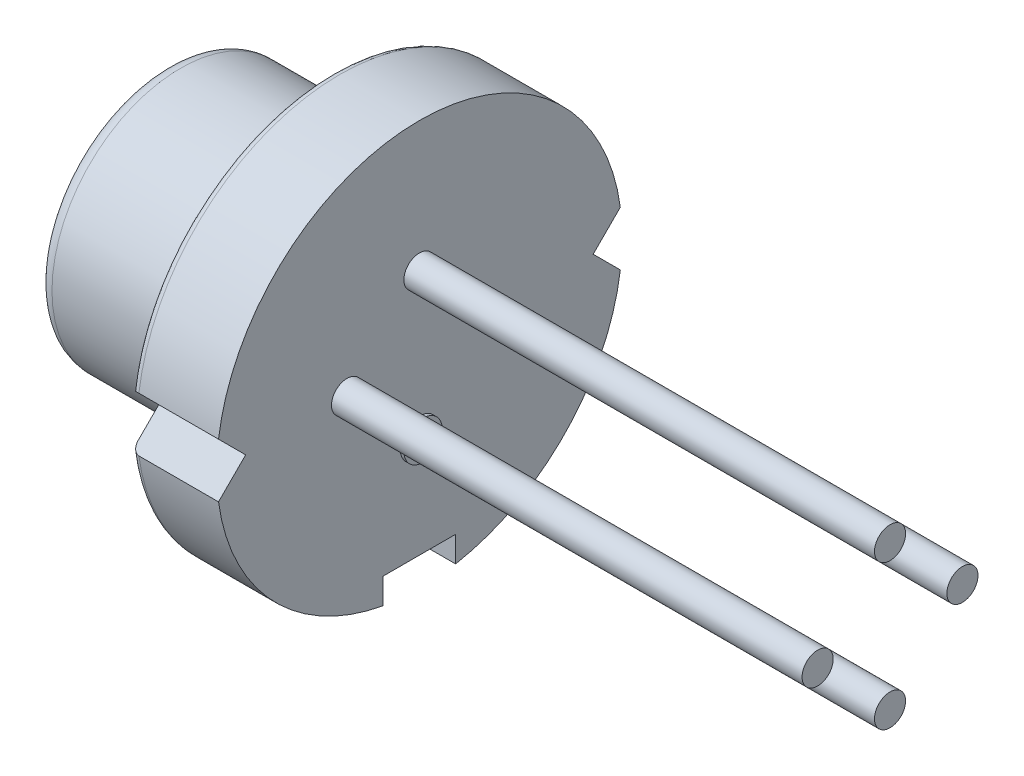
ISO-10303-21;
HEADER;
FILE_DESCRIPTION(('STEP AP214'),'2;1');
FILE_NAME('part.step','',(''),(''),'','','');
FILE_SCHEMA(('AUTOMOTIVE_DESIGN { 1 0 10303 214 1 1 1 1 }'));
ENDSEC;
DATA;
#1=APPLICATION_CONTEXT('core data for automotive mechanical design processes');
#2=APPLICATION_PROTOCOL_DEFINITION('international standard','automotive_design',2000,#1);
#3=PRODUCT_CONTEXT('',#1,'mechanical');
#4=PRODUCT('Part','Part','',(#3));
#5=PRODUCT_RELATED_PRODUCT_CATEGORY('part','',(#4));
#6=PRODUCT_DEFINITION_FORMATION('','',#4);
#7=PRODUCT_DEFINITION_CONTEXT('part definition',#1,'design');
#8=PRODUCT_DEFINITION('design','',#6,#7);
#9=PRODUCT_DEFINITION_SHAPE('','',#8);
#10=(LENGTH_UNIT() NAMED_UNIT(*) SI_UNIT(.MILLI.,.METRE.));
#11=(NAMED_UNIT(*) PLANE_ANGLE_UNIT() SI_UNIT($,.RADIAN.));
#12=(NAMED_UNIT(*) SI_UNIT($,.STERADIAN.) SOLID_ANGLE_UNIT());
#13=UNCERTAINTY_MEASURE_WITH_UNIT(LENGTH_MEASURE(1.E-05),#10,'distance_accuracy_value','');
#14=(GEOMETRIC_REPRESENTATION_CONTEXT(3) GLOBAL_UNCERTAINTY_ASSIGNED_CONTEXT((#13)) GLOBAL_UNIT_ASSIGNED_CONTEXT((#10,
#11,#12)) REPRESENTATION_CONTEXT('',''));
#15=CARTESIAN_POINT('',(0.,0.,0.));
#16=DIRECTION('',(0.,0.,1.));
#17=DIRECTION('',(1.,0.,0.));
#18=AXIS2_PLACEMENT_3D('',#15,#16,#17);
#19=CARTESIAN_POINT('',(2.5,0.,0.));
#20=DIRECTION('',(-1.,0.,0.));
#21=DIRECTION('',(0.,0.,1.));
#22=AXIS2_PLACEMENT_3D('',#19,#20,#21);
#23=PLANE('',#22);
#24=DIRECTION('',(0.,1.,0.));
#25=VECTOR('',#24,1.);
#26=CARTESIAN_POINT('',(2.5,0.,0.5));
#27=LINE('',#26,#25);
#28=CARTESIAN_POINT('',(2.5,-2.75499546279118,0.5));
#29=VERTEX_POINT('',#28);
#30=CARTESIAN_POINT('',(2.5,-2.4,0.5));
#31=VERTEX_POINT('',#30);
#32=EDGE_CURVE('E133',#29,#31,#27,.T.);
#33=ORIENTED_EDGE('',*,*,#32,.T.);
#34=DIRECTION('',(0.,0.,1.));
#35=VECTOR('',#34,1.);
#36=CARTESIAN_POINT('',(2.5,-2.4,0.));
#37=LINE('',#36,#35);
#38=CARTESIAN_POINT('',(2.5,-2.4,-0.5));
#39=VERTEX_POINT('',#38);
#40=EDGE_CURVE('E431',#39,#31,#37,.T.);
#41=ORIENTED_EDGE('',*,*,#40,.F.);
#42=DIRECTION('',(0.,1.,0.));
#43=VECTOR('',#42,1.);
#44=CARTESIAN_POINT('',(2.5,0.,-0.5));
#45=LINE('',#44,#43);
#46=CARTESIAN_POINT('',(2.5,-2.75499546279118,-0.5));
#47=VERTEX_POINT('',#46);
#48=EDGE_CURVE('E144',#47,#39,#45,.T.);
#49=ORIENTED_EDGE('',*,*,#48,.F.);
#50=CARTESIAN_POINT('',(2.5,0.,0.));
#51=DIRECTION('',(-1.,0.,0.));
#52=DIRECTION('',(0.,0.,1.));
#53=AXIS2_PLACEMENT_3D('',#50,#51,#52);
#54=CIRCLE('',#53,2.8);
#55=CARTESIAN_POINT('',(2.5,-0.374801574802347,-2.77480157480236));
#56=VERTEX_POINT('',#55);
#57=EDGE_CURVE('E162',#56,#47,#54,.T.);
#58=ORIENTED_EDGE('',*,*,#57,.F.);
#59=DIRECTION('',(0.,-0.707106781186532,-0.707106781186563));
#60=VECTOR('',#59,1.);
#61=CARTESIAN_POINT('',(2.5,1.2,-1.19999999999995));
#62=LINE('',#61,#60);
#63=CARTESIAN_POINT('',(2.5,0.,-2.4));
#64=VERTEX_POINT('',#63);
#65=EDGE_CURVE('E419',#64,#56,#62,.T.);
#66=ORIENTED_EDGE('',*,*,#65,.F.);
#67=DIRECTION('',(0.,0.707106781186531,-0.707106781186564));
#68=VECTOR('',#67,1.);
#69=CARTESIAN_POINT('',(2.5,-1.2,-1.19999999999994));
#70=LINE('',#69,#68);
#71=CARTESIAN_POINT('',(2.5,0.374801574802347,-2.77480157480236));
#72=VERTEX_POINT('',#71);
#73=EDGE_CURVE('E422',#64,#72,#70,.T.);
#74=ORIENTED_EDGE('',*,*,#73,.T.);
#75=CARTESIAN_POINT('',(2.5,0.374801574802348,2.77480157480236));
#76=VERTEX_POINT('',#75);
#77=EDGE_CURVE('E165',#76,#72,#54,.T.);
#78=ORIENTED_EDGE('',*,*,#77,.F.);
#79=DIRECTION('',(0.,0.707106781186532,0.707106781186563));
#80=VECTOR('',#79,1.);
#81=CARTESIAN_POINT('',(2.5,-1.2,1.19999999999995));
#82=LINE('',#81,#80);
#83=CARTESIAN_POINT('',(2.5,0.,2.4));
#84=VERTEX_POINT('',#83);
#85=EDGE_CURVE('E408',#84,#76,#82,.T.);
#86=ORIENTED_EDGE('',*,*,#85,.F.);
#87=DIRECTION('',(0.,-0.707106781186532,0.707106781186563));
#88=VECTOR('',#87,1.);
#89=CARTESIAN_POINT('',(2.5,1.2,1.19999999999995));
#90=LINE('',#89,#88);
#91=CARTESIAN_POINT('',(2.5,-0.374801574802348,2.77480157480236));
#92=VERTEX_POINT('',#91);
#93=EDGE_CURVE('E161',#84,#92,#90,.T.);
#94=ORIENTED_EDGE('',*,*,#93,.T.);
#95=EDGE_CURVE('E151',#29,#92,#54,.T.);
#96=ORIENTED_EDGE('',*,*,#95,.F.);
#97=EDGE_LOOP('',(#33,#41,#49,#58,#66,#74,#78,#86,#94,#96));
#98=FACE_BOUND('',#97,.T.);
#99=CARTESIAN_POINT('',(2.5,0.,-1.));
#100=DIRECTION('',(-1.,0.,0.));
#101=DIRECTION('',(0.,0.,1.));
#102=AXIS2_PLACEMENT_3D('',#99,#100,#101);
#103=CIRCLE('',#102,0.215);
#104=CARTESIAN_POINT('',(2.5,0.,-0.785));
#105=VERTEX_POINT('',#104);
#106=EDGE_CURVE('E190',#105,#105,#103,.F.);
#107=ORIENTED_EDGE('',*,*,#106,.F.);
#108=EDGE_LOOP('',(#107));
#109=FACE_BOUND('',#108,.T.);
#110=CARTESIAN_POINT('',(2.5,0.,1.));
#111=DIRECTION('',(-1.,0.,0.));
#112=DIRECTION('',(0.,0.,1.));
#113=AXIS2_PLACEMENT_3D('',#110,#111,#112);
#114=CIRCLE('',#113,0.215);
#115=CARTESIAN_POINT('',(2.5,0.,1.215));
#116=VERTEX_POINT('',#115);
#117=EDGE_CURVE('E187',#116,#116,#114,.F.);
#118=ORIENTED_EDGE('',*,*,#117,.F.);
#119=EDGE_LOOP('',(#118));
#120=FACE_BOUND('',#119,.T.);
#121=CARTESIAN_POINT('',(2.5,1.,0.));
#122=DIRECTION('',(-1.,0.,0.));
#123=DIRECTION('',(0.,0.,1.));
#124=AXIS2_PLACEMENT_3D('',#121,#122,#123);
#125=CIRCLE('',#124,0.215);
#126=CARTESIAN_POINT('',(2.5,1.,0.215));
#127=VERTEX_POINT('',#126);
#128=EDGE_CURVE('E193',#127,#127,#125,.F.);
#129=ORIENTED_EDGE('',*,*,#128,.F.);
#130=EDGE_LOOP('',(#129));
#131=FACE_BOUND('',#130,.T.);
#132=CARTESIAN_POINT('',(2.5,-1.,0.));
#133=DIRECTION('',(-1.,0.,0.));
#134=DIRECTION('',(0.,0.,1.));
#135=AXIS2_PLACEMENT_3D('',#132,#133,#134);
#136=CIRCLE('',#135,0.265);
#137=CARTESIAN_POINT('',(2.5,-1.,0.265));
#138=VERTEX_POINT('',#137);
#139=EDGE_CURVE('E11',#138,#138,#136,.F.);
#140=ORIENTED_EDGE('',*,*,#139,.F.);
#141=EDGE_LOOP('',(#140));
#142=FACE_BOUND('',#141,.T.);
#143=ADVANCED_FACE('F37',(#98,#109,#120,#131,#142),#23,.F.);
#144=CARTESIAN_POINT('',(1.3,2.8,0.));
#145=DIRECTION('',(1.,0.,0.));
#146=DIRECTION('',(0.,0.,-1.));
#147=AXIS2_PLACEMENT_3D('',#144,#145,#146);
#148=PLANE('',#147);
#149=CARTESIAN_POINT('',(1.3,0.,0.));
#150=DIRECTION('',(-1.,0.,0.));
#151=DIRECTION('',(0.,0.,1.));
#152=AXIS2_PLACEMENT_3D('',#149,#150,#151);
#153=CIRCLE('',#152,2.1);
#154=CARTESIAN_POINT('',(1.3,0.,2.1));
#155=VERTEX_POINT('',#154);
#156=EDGE_CURVE('E172',#155,#155,#153,.T.);
#157=ORIENTED_EDGE('',*,*,#156,.F.);
#158=EDGE_LOOP('',(#157));
#159=FACE_BOUND('',#158,.T.);
#160=DIRECTION('',(0.,-0.707106781186532,-0.707106781186563));
#161=VECTOR('',#160,1.);
#162=CARTESIAN_POINT('',(1.3,2.59999999999994,0.200000000000053));
#163=LINE('',#162,#161);
#164=CARTESIAN_POINT('',(1.3,0.,-2.4));
#165=VERTEX_POINT('',#164);
#166=CARTESIAN_POINT('',(1.3,-0.28492424049174,-2.68492424049175));
#167=VERTEX_POINT('',#166);
#168=EDGE_CURVE('E414',#165,#167,#163,.T.);
#169=ORIENTED_EDGE('',*,*,#168,.T.);
#170=CARTESIAN_POINT('',(1.3,0.,0.));
#171=DIRECTION('',(1.,0.,0.));
#172=DIRECTION('',(0.,0.,-1.));
#173=AXIS2_PLACEMENT_3D('',#170,#171,#172);
#174=CIRCLE('',#173,2.7);
#175=CARTESIAN_POINT('',(1.3,-2.65329983228432,-0.5));
#176=VERTEX_POINT('',#175);
#177=EDGE_CURVE('E220',#167,#176,#174,.F.);
#178=ORIENTED_EDGE('',*,*,#177,.T.);
#179=DIRECTION('',(0.,1.,0.));
#180=VECTOR('',#179,1.);
#181=CARTESIAN_POINT('',(1.3,2.8,-0.5));
#182=LINE('',#181,#180);
#183=CARTESIAN_POINT('',(1.3,-2.4,-0.5));
#184=VERTEX_POINT('',#183);
#185=EDGE_CURVE('E427',#176,#184,#182,.T.);
#186=ORIENTED_EDGE('',*,*,#185,.T.);
#187=DIRECTION('',(0.,0.,1.));
#188=VECTOR('',#187,1.);
#189=CARTESIAN_POINT('',(1.3,-2.4,0.));
#190=LINE('',#189,#188);
#191=CARTESIAN_POINT('',(1.3,-2.4,0.5));
#192=VERTEX_POINT('',#191);
#193=EDGE_CURVE('E155',#184,#192,#190,.T.);
#194=ORIENTED_EDGE('',*,*,#193,.T.);
#195=DIRECTION('',(0.,1.,0.));
#196=VECTOR('',#195,1.);
#197=CARTESIAN_POINT('',(1.3,2.8,0.5));
#198=LINE('',#197,#196);
#199=CARTESIAN_POINT('',(1.3,-2.65329983228432,0.5));
#200=VERTEX_POINT('',#199);
#201=EDGE_CURVE('E425',#200,#192,#198,.T.);
#202=ORIENTED_EDGE('',*,*,#201,.F.);
#203=CARTESIAN_POINT('',(1.3,0.,0.));
#204=DIRECTION('',(1.,0.,0.));
#205=DIRECTION('',(0.,0.,-1.));
#206=AXIS2_PLACEMENT_3D('',#203,#204,#205);
#207=CIRCLE('',#206,2.7);
#208=CARTESIAN_POINT('',(1.3,-0.284924240491739,2.68492424049175));
#209=VERTEX_POINT('',#208);
#210=EDGE_CURVE('E217',#200,#209,#207,.F.);
#211=ORIENTED_EDGE('',*,*,#210,.T.);
#212=DIRECTION('',(0.,-0.707106781186532,0.707106781186563));
#213=VECTOR('',#212,1.);
#214=CARTESIAN_POINT('',(1.3,2.59999999999994,-0.200000000000053));
#215=LINE('',#214,#213);
#216=CARTESIAN_POINT('',(1.3,0.,2.4));
#217=VERTEX_POINT('',#216);
#218=EDGE_CURVE('E400',#217,#209,#215,.T.);
#219=ORIENTED_EDGE('',*,*,#218,.F.);
#220=DIRECTION('',(0.,0.707106781186532,0.707106781186563));
#221=VECTOR('',#220,1.);
#222=CARTESIAN_POINT('',(1.3,0.199999999999939,2.59999999999995));
#223=LINE('',#222,#221);
#224=CARTESIAN_POINT('',(1.3,0.284924240491739,2.68492424049175));
#225=VERTEX_POINT('',#224);
#226=EDGE_CURVE('E403',#217,#225,#223,.T.);
#227=ORIENTED_EDGE('',*,*,#226,.T.);
#228=CARTESIAN_POINT('',(1.3,0.,0.));
#229=DIRECTION('',(1.,0.,0.));
#230=DIRECTION('',(0.,0.,-1.));
#231=AXIS2_PLACEMENT_3D('',#228,#229,#230);
#232=CIRCLE('',#231,2.7);
#233=CARTESIAN_POINT('',(1.3,0.284924240491738,-2.68492424049175));
#234=VERTEX_POINT('',#233);
#235=EDGE_CURVE('E214',#225,#234,#232,.F.);
#236=ORIENTED_EDGE('',*,*,#235,.T.);
#237=DIRECTION('',(0.,0.707106781186531,-0.707106781186564));
#238=VECTOR('',#237,1.);
#239=CARTESIAN_POINT('',(1.3,0.199999999999934,-2.59999999999994));
#240=LINE('',#239,#238);
#241=EDGE_CURVE('E412',#165,#234,#240,.T.);
#242=ORIENTED_EDGE('',*,*,#241,.F.);
#243=EDGE_LOOP('',(#169,#178,#186,#194,#202,#211,#219,#227,#236,#242));
#244=FACE_BOUND('',#243,.T.);
#245=ADVANCED_FACE('F336',(#159,#244),#148,.F.);
#246=CARTESIAN_POINT('',(-2.49171245983604,0.,0.));
#247=DIRECTION('',(-1.,0.,0.));
#248=DIRECTION('',(0.,0.,1.));
#249=AXIS2_PLACEMENT_3D('',#246,#247,#248);
#250=CYLINDRICAL_SURFACE('',#249,2.8);
#251=DIRECTION('',(-1.,0.,0.));
#252=VECTOR('',#251,1.);
#253=CARTESIAN_POINT('',(-2.49171245983604,-0.374801574802348,2.77480157480236));
#254=LINE('',#253,#252);
#255=CARTESIAN_POINT('',(1.4,-0.374801574802348,2.77480157480236));
#256=VERTEX_POINT('',#255);
#257=EDGE_CURVE('E198',#256,#92,#254,.F.);
#258=ORIENTED_EDGE('',*,*,#257,.F.);
#259=CARTESIAN_POINT('',(1.4,0.,0.));
#260=DIRECTION('',(1.,0.,0.));
#261=DIRECTION('',(0.,0.,-1.));
#262=AXIS2_PLACEMENT_3D('',#259,#260,#261);
#263=CIRCLE('',#262,2.8);
#264=CARTESIAN_POINT('',(1.4,-2.75499546279118,0.5));
#265=VERTEX_POINT('',#264);
#266=EDGE_CURVE('E154',#256,#265,#263,.T.);
#267=ORIENTED_EDGE('',*,*,#266,.T.);
#268=DIRECTION('',(-1.,0.,0.));
#269=VECTOR('',#268,1.);
#270=CARTESIAN_POINT('',(-2.49171245983604,-2.75499546279118,0.5));
#271=LINE('',#270,#269);
#272=EDGE_CURVE('E136',#29,#265,#271,.T.);
#273=ORIENTED_EDGE('',*,*,#272,.F.);
#274=ORIENTED_EDGE('',*,*,#95,.T.);
#275=EDGE_LOOP('',(#258,#267,#273,#274));
#276=FACE_BOUND('',#275,.T.);
#277=ADVANCED_FACE('F150',(#276),#250,.T.);
#278=DIRECTION('',(-1.,0.,0.));
#279=VECTOR('',#278,1.);
#280=CARTESIAN_POINT('',(-2.49171245983604,0.374801574802347,-2.77480157480236));
#281=LINE('',#280,#279);
#282=CARTESIAN_POINT('',(1.4,0.374801574802347,-2.77480157480236));
#283=VERTEX_POINT('',#282);
#284=EDGE_CURVE('E202',#283,#72,#281,.F.);
#285=ORIENTED_EDGE('',*,*,#284,.F.);
#286=CARTESIAN_POINT('',(1.4,0.,0.));
#287=DIRECTION('',(1.,0.,0.));
#288=DIRECTION('',(0.,0.,-1.));
#289=AXIS2_PLACEMENT_3D('',#286,#287,#288);
#290=CIRCLE('',#289,2.8);
#291=CARTESIAN_POINT('',(1.4,0.374801574802348,2.77480157480236));
#292=VERTEX_POINT('',#291);
#293=EDGE_CURVE('E53',#283,#292,#290,.T.);
#294=ORIENTED_EDGE('',*,*,#293,.T.);
#295=DIRECTION('',(-1.,0.,0.));
#296=VECTOR('',#295,1.);
#297=CARTESIAN_POINT('',(-2.49171245983604,0.374801574802348,2.77480157480236));
#298=LINE('',#297,#296);
#299=EDGE_CURVE('E196',#292,#76,#298,.F.);
#300=ORIENTED_EDGE('',*,*,#299,.T.);
#301=ORIENTED_EDGE('',*,*,#77,.T.);
#302=EDGE_LOOP('',(#285,#294,#300,#301));
#303=FACE_BOUND('',#302,.T.);
#304=ADVANCED_FACE('F341',(#303),#250,.T.);
#305=DIRECTION('',(-1.,0.,0.));
#306=VECTOR('',#305,1.);
#307=CARTESIAN_POINT('',(-2.49171245983604,-2.75499546279118,-0.5));
#308=LINE('',#307,#306);
#309=CARTESIAN_POINT('',(1.4,-2.75499546279118,-0.5));
#310=VERTEX_POINT('',#309);
#311=EDGE_CURVE('E156',#47,#310,#308,.T.);
#312=ORIENTED_EDGE('',*,*,#311,.T.);
#313=CARTESIAN_POINT('',(1.4,0.,0.));
#314=DIRECTION('',(1.,0.,0.));
#315=DIRECTION('',(0.,0.,-1.));
#316=AXIS2_PLACEMENT_3D('',#313,#314,#315);
#317=CIRCLE('',#316,2.8);
#318=CARTESIAN_POINT('',(1.4,-0.374801574802348,-2.77480157480236));
#319=VERTEX_POINT('',#318);
#320=EDGE_CURVE('E230',#310,#319,#317,.T.);
#321=ORIENTED_EDGE('',*,*,#320,.T.);
#322=DIRECTION('',(-1.,0.,0.));
#323=VECTOR('',#322,1.);
#324=CARTESIAN_POINT('',(-2.49171245983604,-0.374801574802348,-2.77480157480236));
#325=LINE('',#324,#323);
#326=EDGE_CURVE('E200',#319,#56,#325,.F.);
#327=ORIENTED_EDGE('',*,*,#326,.T.);
#328=ORIENTED_EDGE('',*,*,#57,.T.);
#329=EDGE_LOOP('',(#312,#321,#327,#328));
#330=FACE_BOUND('',#329,.T.);
#331=ADVANCED_FACE('F337',(#330),#250,.T.);
#332=CARTESIAN_POINT('',(-1.,0.8,0.));
#333=DIRECTION('',(1.,0.,0.));
#334=DIRECTION('',(0.,0.,-1.));
#335=AXIS2_PLACEMENT_3D('',#332,#333,#334);
#336=PLANE('',#335);
#337=CARTESIAN_POINT('',(-1.,0.,0.));
#338=DIRECTION('',(1.,0.,0.));
#339=DIRECTION('',(0.,0.,-1.));
#340=AXIS2_PLACEMENT_3D('',#337,#338,#339);
#341=CIRCLE('',#340,1.575);
#342=CARTESIAN_POINT('',(-1.,0.,-1.575));
#343=VERTEX_POINT('',#342);
#344=EDGE_CURVE('E208',#343,#343,#341,.F.);
#345=ORIENTED_EDGE('',*,*,#344,.T.);
#346=EDGE_LOOP('',(#345));
#347=FACE_BOUND('',#346,.T.);
#348=CARTESIAN_POINT('',(-1.,0.,0.));
#349=DIRECTION('',(-1.,0.,0.));
#350=DIRECTION('',(0.,0.,1.));
#351=AXIS2_PLACEMENT_3D('',#348,#349,#350);
#352=CIRCLE('',#351,0.8);
#353=CARTESIAN_POINT('',(-1.,0.,0.8));
#354=VERTEX_POINT('',#353);
#355=EDGE_CURVE('E375',#354,#354,#352,.T.);
#356=ORIENTED_EDGE('',*,*,#355,.F.);
#357=EDGE_LOOP('',(#356));
#358=FACE_BOUND('',#357,.T.);
#359=ADVANCED_FACE('F340',(#347,#358),#336,.F.);
#360=CARTESIAN_POINT('',(-2.49171245983604,0.,0.));
#361=DIRECTION('',(-1.,0.,0.));
#362=DIRECTION('',(0.,0.,1.));
#363=AXIS2_PLACEMENT_3D('',#360,#361,#362);
#364=CYLINDRICAL_SURFACE('',#363,1.775);
#365=CARTESIAN_POINT('',(-0.8,0.,0.));
#366=DIRECTION('',(1.,0.,0.));
#367=DIRECTION('',(0.,0.,-1.));
#368=AXIS2_PLACEMENT_3D('',#365,#366,#367);
#369=CIRCLE('',#368,1.775);
#370=CARTESIAN_POINT('',(-0.8,0.,-1.775));
#371=VERTEX_POINT('',#370);
#372=EDGE_CURVE('E211',#371,#371,#369,.T.);
#373=ORIENTED_EDGE('',*,*,#372,.T.);
#374=EDGE_LOOP('',(#373));
#375=FACE_BOUND('',#374,.T.);
#376=CARTESIAN_POINT('',(0.75,0.,0.));
#377=DIRECTION('',(-1.,0.,0.));
#378=DIRECTION('',(0.,0.,1.));
#379=AXIS2_PLACEMENT_3D('',#376,#377,#378);
#380=CIRCLE('',#379,1.775);
#381=CARTESIAN_POINT('',(0.75,0.,1.775));
#382=VERTEX_POINT('',#381);
#383=EDGE_CURVE('E184',#382,#382,#380,.T.);
#384=ORIENTED_EDGE('',*,*,#383,.T.);
#385=EDGE_LOOP('',(#384));
#386=FACE_BOUND('',#385,.T.);
#387=ADVANCED_FACE('F356',(#375,#386),#364,.T.);
#388=CARTESIAN_POINT('',(0.75,0.,0.));
#389=DIRECTION('',(-1.,0.,0.));
#390=DIRECTION('',(0.,0.,1.));
#391=AXIS2_PLACEMENT_3D('',#388,#389,#390);
#392=TOROIDAL_SURFACE('',#391,2.025,0.25);
#393=ORIENTED_EDGE('',*,*,#383,.F.);
#394=EDGE_LOOP('',(#393));
#395=FACE_BOUND('',#394,.T.);
#396=CARTESIAN_POINT('',(1.,0.,0.));
#397=DIRECTION('',(-1.,0.,0.));
#398=DIRECTION('',(0.,0.,1.));
#399=AXIS2_PLACEMENT_3D('',#396,#397,#398);
#400=CIRCLE('',#399,2.025);
#401=CARTESIAN_POINT('',(1.,0.,2.025));
#402=VERTEX_POINT('',#401);
#403=EDGE_CURVE('E179',#402,#402,#400,.T.);
#404=ORIENTED_EDGE('',*,*,#403,.T.);
#405=EDGE_LOOP('',(#404));
#406=FACE_BOUND('',#405,.T.);
#407=ADVANCED_FACE('F352',(#395,#406),#392,.F.);
#408=CARTESIAN_POINT('',(1.,2.1,0.));
#409=DIRECTION('',(1.,0.,0.));
#410=DIRECTION('',(0.,0.,-1.));
#411=AXIS2_PLACEMENT_3D('',#408,#409,#410);
#412=PLANE('',#411);
#413=ORIENTED_EDGE('',*,*,#403,.F.);
#414=EDGE_LOOP('',(#413));
#415=FACE_BOUND('',#414,.T.);
#416=CARTESIAN_POINT('',(0.999999999999999,0.,0.));
#417=DIRECTION('',(-1.,0.,0.));
#418=DIRECTION('',(0.,0.,1.));
#419=AXIS2_PLACEMENT_3D('',#416,#417,#418);
#420=CIRCLE('',#419,2.1);
#421=CARTESIAN_POINT('',(0.999999999999999,0.,2.1));
#422=VERTEX_POINT('',#421);
#423=EDGE_CURVE('E175',#422,#422,#420,.T.);
#424=ORIENTED_EDGE('',*,*,#423,.T.);
#425=EDGE_LOOP('',(#424));
#426=FACE_BOUND('',#425,.T.);
#427=ADVANCED_FACE('F348',(#415,#426),#412,.F.);
#428=CARTESIAN_POINT('',(-2.49171245983604,0.,0.));
#429=DIRECTION('',(-1.,0.,0.));
#430=DIRECTION('',(0.,0.,1.));
#431=AXIS2_PLACEMENT_3D('',#428,#429,#430);
#432=CYLINDRICAL_SURFACE('',#431,2.1);
#433=ORIENTED_EDGE('',*,*,#423,.F.);
#434=EDGE_LOOP('',(#433));
#435=FACE_BOUND('',#434,.T.);
#436=ORIENTED_EDGE('',*,*,#156,.T.);
#437=EDGE_LOOP('',(#436));
#438=FACE_BOUND('',#437,.T.);
#439=ADVANCED_FACE('F332',(#435,#438),#432,.T.);
#440=CARTESIAN_POINT('',(0.,0.,0.));
#441=DIRECTION('',(1.,0.,0.));
#442=DIRECTION('',(0.,0.,-1.));
#443=AXIS2_PLACEMENT_3D('',#440,#441,#442);
#444=PLANE('',#443);
#445=CARTESIAN_POINT('',(0.,0.,0.));
#446=DIRECTION('',(-1.,0.,0.));
#447=DIRECTION('',(0.,0.,1.));
#448=AXIS2_PLACEMENT_3D('',#445,#446,#447);
#449=CIRCLE('',#448,0.7);
#450=CARTESIAN_POINT('',(0.,0.,0.7));
#451=VERTEX_POINT('',#450);
#452=EDGE_CURVE('E163',#451,#451,#449,.T.);
#453=ORIENTED_EDGE('',*,*,#452,.T.);
#454=EDGE_LOOP('',(#453));
#455=FACE_BOUND('',#454,.T.);
#456=ADVANCED_FACE('F328',(#455),#444,.F.);
#457=CARTESIAN_POINT('',(-2.49171245983604,0.,0.));
#458=DIRECTION('',(-1.,0.,0.));
#459=DIRECTION('',(0.,0.,1.));
#460=AXIS2_PLACEMENT_3D('',#457,#458,#459);
#461=CYLINDRICAL_SURFACE('',#460,0.7);
#462=ORIENTED_EDGE('',*,*,#452,.F.);
#463=EDGE_LOOP('',(#462));
#464=FACE_BOUND('',#463,.T.);
#465=CARTESIAN_POINT('',(-0.75,0.,0.));
#466=DIRECTION('',(-1.,0.,0.));
#467=DIRECTION('',(0.,0.,1.));
#468=AXIS2_PLACEMENT_3D('',#465,#466,#467);
#469=CIRCLE('',#468,0.7);
#470=CARTESIAN_POINT('',(-0.75,0.,0.7));
#471=VERTEX_POINT('',#470);
#472=EDGE_CURVE('E168',#471,#471,#469,.T.);
#473=ORIENTED_EDGE('',*,*,#472,.T.);
#474=EDGE_LOOP('',(#473));
#475=FACE_BOUND('',#474,.T.);
#476=ADVANCED_FACE('F324',(#464,#475),#461,.F.);
#477=CARTESIAN_POINT('',(-0.75,0.8,0.));
#478=DIRECTION('',(1.,0.,0.));
#479=DIRECTION('',(0.,0.,-1.));
#480=AXIS2_PLACEMENT_3D('',#477,#478,#479);
#481=PLANE('',#480);
#482=ORIENTED_EDGE('',*,*,#472,.F.);
#483=EDGE_LOOP('',(#482));
#484=FACE_BOUND('',#483,.T.);
#485=CARTESIAN_POINT('',(-0.75,0.,0.));
#486=DIRECTION('',(-1.,0.,0.));
#487=DIRECTION('',(0.,0.,1.));
#488=AXIS2_PLACEMENT_3D('',#485,#486,#487);
#489=CIRCLE('',#488,0.8);
#490=CARTESIAN_POINT('',(-0.75,0.,0.8));
#491=VERTEX_POINT('',#490);
#492=EDGE_CURVE('E377',#491,#491,#489,.T.);
#493=ORIENTED_EDGE('',*,*,#492,.T.);
#494=EDGE_LOOP('',(#493));
#495=FACE_BOUND('',#494,.T.);
#496=ADVANCED_FACE('F320',(#484,#495),#481,.F.);
#497=CARTESIAN_POINT('',(-2.49171245983604,0.,0.));
#498=DIRECTION('',(-1.,0.,0.));
#499=DIRECTION('',(0.,0.,1.));
#500=AXIS2_PLACEMENT_3D('',#497,#498,#499);
#501=CYLINDRICAL_SURFACE('',#500,0.8);
#502=ORIENTED_EDGE('',*,*,#492,.F.);
#503=EDGE_LOOP('',(#502));
#504=FACE_BOUND('',#503,.T.);
#505=ORIENTED_EDGE('',*,*,#355,.T.);
#506=EDGE_LOOP('',(#505));
#507=FACE_BOUND('',#506,.T.);
#508=ADVANCED_FACE('F304',(#504,#507),#501,.F.);
#509=CARTESIAN_POINT('',(9.,0.,1.));
#510=DIRECTION('',(-1.,0.,0.));
#511=DIRECTION('',(0.,0.,1.));
#512=AXIS2_PLACEMENT_3D('',#509,#510,#511);
#513=CYLINDRICAL_SURFACE('',#512,0.215);
#514=CARTESIAN_POINT('',(9.,0.,1.));
#515=DIRECTION('',(1.,0.,0.));
#516=DIRECTION('',(0.,0.,-1.));
#517=AXIS2_PLACEMENT_3D('',#514,#515,#516);
#518=CIRCLE('',#517,0.215);
#519=CARTESIAN_POINT('',(9.,0.,0.785));
#520=VERTEX_POINT('',#519);
#521=EDGE_CURVE('E383',#520,#520,#518,.T.);
#522=ORIENTED_EDGE('',*,*,#521,.F.);
#523=EDGE_LOOP('',(#522));
#524=FACE_BOUND('',#523,.T.);
#525=ORIENTED_EDGE('',*,*,#117,.T.);
#526=EDGE_LOOP('',(#525));
#527=FACE_BOUND('',#526,.T.);
#528=ADVANCED_FACE('F301',(#524,#527),#513,.T.);
#529=CARTESIAN_POINT('',(9.,0.,0.));
#530=DIRECTION('',(1.,0.,0.));
#531=DIRECTION('',(0.,0.,-1.));
#532=AXIS2_PLACEMENT_3D('',#529,#530,#531);
#533=PLANE('',#532);
#534=ORIENTED_EDGE('',*,*,#521,.T.);
#535=EDGE_LOOP('',(#534));
#536=FACE_BOUND('',#535,.T.);
#537=ADVANCED_FACE('F296',(#536),#533,.T.);
#538=CARTESIAN_POINT('',(9.,0.,-1.));
#539=DIRECTION('',(-1.,0.,0.));
#540=DIRECTION('',(0.,0.,1.));
#541=AXIS2_PLACEMENT_3D('',#538,#539,#540);
#542=CYLINDRICAL_SURFACE('',#541,0.215);
#543=CARTESIAN_POINT('',(9.,0.,-1.));
#544=DIRECTION('',(1.,0.,0.));
#545=DIRECTION('',(0.,0.,-1.));
#546=AXIS2_PLACEMENT_3D('',#543,#544,#545);
#547=CIRCLE('',#546,0.215);
#548=CARTESIAN_POINT('',(9.,0.,-1.215));
#549=VERTEX_POINT('',#548);
#550=EDGE_CURVE('E394',#549,#549,#547,.T.);
#551=ORIENTED_EDGE('',*,*,#550,.F.);
#552=EDGE_LOOP('',(#551));
#553=FACE_BOUND('',#552,.T.);
#554=ORIENTED_EDGE('',*,*,#106,.T.);
#555=EDGE_LOOP('',(#554));
#556=FACE_BOUND('',#555,.T.);
#557=ADVANCED_FACE('F293',(#553,#556),#542,.T.);
#558=CARTESIAN_POINT('',(9.,0.,0.));
#559=DIRECTION('',(1.,0.,0.));
#560=DIRECTION('',(0.,0.,-1.));
#561=AXIS2_PLACEMENT_3D('',#558,#559,#560);
#562=PLANE('',#561);
#563=ORIENTED_EDGE('',*,*,#550,.T.);
#564=EDGE_LOOP('',(#563));
#565=FACE_BOUND('',#564,.T.);
#566=ADVANCED_FACE('F288',(#565),#562,.T.);
#567=CARTESIAN_POINT('',(9.,1.,0.));
#568=DIRECTION('',(-1.,0.,0.));
#569=DIRECTION('',(0.,0.,1.));
#570=AXIS2_PLACEMENT_3D('',#567,#568,#569);
#571=CYLINDRICAL_SURFACE('',#570,0.215);
#572=CARTESIAN_POINT('',(9.,1.,0.));
#573=DIRECTION('',(1.,0.,0.));
#574=DIRECTION('',(0.,0.,-1.));
#575=AXIS2_PLACEMENT_3D('',#572,#573,#574);
#576=CIRCLE('',#575,0.215);
#577=CARTESIAN_POINT('',(9.,1.,-0.215));
#578=VERTEX_POINT('',#577);
#579=EDGE_CURVE('E397',#578,#578,#576,.T.);
#580=ORIENTED_EDGE('',*,*,#579,.F.);
#581=EDGE_LOOP('',(#580));
#582=FACE_BOUND('',#581,.T.);
#583=ORIENTED_EDGE('',*,*,#128,.T.);
#584=EDGE_LOOP('',(#583));
#585=FACE_BOUND('',#584,.T.);
#586=ADVANCED_FACE('F285',(#582,#585),#571,.T.);
#587=CARTESIAN_POINT('',(9.,1.,0.));
#588=DIRECTION('',(1.,0.,0.));
#589=DIRECTION('',(0.,0.,-1.));
#590=AXIS2_PLACEMENT_3D('',#587,#588,#589);
#591=PLANE('',#590);
#592=ORIENTED_EDGE('',*,*,#579,.T.);
#593=EDGE_LOOP('',(#592));
#594=FACE_BOUND('',#593,.T.);
#595=ADVANCED_FACE('F282',(#594),#591,.T.);
#596=CARTESIAN_POINT('',(-1.,1.2,1.19999999999995));
#597=DIRECTION('',(0.,0.707106781186563,0.707106781186532));
#598=DIRECTION('',(0.,-0.707106781186532,0.707106781186563));
#599=AXIS2_PLACEMENT_3D('',#596,#597,#598);
#600=PLANE('',#599);
#601=ORIENTED_EDGE('',*,*,#218,.T.);
#602=CARTESIAN_POINT('',(1.3,-0.284924240491739,2.68492424049175));
#603=CARTESIAN_POINT('',(1.30000314330062,-0.290889166104018,2.69088916610403));
#604=CARTESIAN_POINT('',(1.30064660298432,-0.296865870056298,2.69686587005631));
#605=CARTESIAN_POINT('',(1.30327084019445,-0.308709978252962,2.70870997825298));
#606=CARTESIAN_POINT('',(1.30526051703549,-0.314576386428519,2.71457638642853));
#607=CARTESIAN_POINT('',(1.31023476035003,-0.32513298563238,2.72513298563239));
#608=CARTESIAN_POINT('',(1.31302691231619,-0.329868191757833,2.72986819175785));
#609=CARTESIAN_POINT('',(1.31965413328064,-0.338950831364426,2.73895083136444));
#610=CARTESIAN_POINT('',(1.32348641763403,-0.34329925963819,2.7432992596382));
#611=CARTESIAN_POINT('',(1.33133444870634,-0.350617798853581,2.7506177988536));
#612=CARTESIAN_POINT('',(1.33516017125947,-0.353689627647388,2.7536896276474));
#613=CARTESIAN_POINT('',(1.34347053582359,-0.359353795542904,2.75935379554292));
#614=CARTESIAN_POINT('',(1.34795469237551,-0.361946484757151,2.76194648475717));
#615=CARTESIAN_POINT('',(1.35678197012857,-0.366166204600509,2.76616620460053));
#616=CARTESIAN_POINT('',(1.36104172410691,-0.367880285372792,2.76788028537281));
#617=CARTESIAN_POINT('',(1.36990355680165,-0.37078152625609,2.77078152625611));
#618=CARTESIAN_POINT('',(1.37450505636146,-0.371969555102833,2.77196955510285));
#619=CARTESIAN_POINT('',(1.38259976036216,-0.373499257346418,2.77349925734643));
#620=CARTESIAN_POINT('',(1.38603941853657,-0.37398514463287,2.77398514463289));
#621=CARTESIAN_POINT('',(1.3929850135162,-0.374637401793578,2.77463740179359));
#622=CARTESIAN_POINT('',(1.39649106094134,-0.374803180237253,2.77480318023727));
#623=CARTESIAN_POINT('',(1.39999999999824,-0.374801574806993,2.77480157480701));
#624=B_SPLINE_CURVE_WITH_KNOTS('',3,(#602,#603,#604,#605,#606,#607,#608,#609,#610,#611,#612,
#613,#614,#615,#616,#617,#618,#619,#620,#621,#622,#623),.UNSPECIFIED.,.F.,.F.,(4,2,2,2,2,2,2,2,
2,2,4),(0.,0.025310765667252,0.0507905071306291,0.0724737167837929,0.0940994391404414,
0.111399509053102,0.128686887195104,0.143329633363186,0.157948107105257,0.168442639667697,
0.178956543362806),.UNSPECIFIED.);
#625=EDGE_CURVE('E267',#209,#256,#624,.T.);
#626=ORIENTED_EDGE('',*,*,#625,.T.);
#627=ORIENTED_EDGE('',*,*,#257,.T.);
#628=ORIENTED_EDGE('',*,*,#93,.F.);
#629=DIRECTION('',(1.,0.,0.));
#630=VECTOR('',#629,1.);
#631=CARTESIAN_POINT('',(-1.,0.,2.4));
#632=LINE('',#631,#630);
#633=EDGE_CURVE('E406',#217,#84,#632,.T.);
#634=ORIENTED_EDGE('',*,*,#633,.F.);
#635=EDGE_LOOP('',(#601,#626,#627,#628,#634));
#636=FACE_BOUND('',#635,.T.);
#637=ADVANCED_FACE('F276',(#636),#600,.T.);
#638=CARTESIAN_POINT('',(-1.,-1.2,1.19999999999995));
#639=DIRECTION('',(0.,0.707106781186563,-0.707106781186532));
#640=DIRECTION('',(0.,0.707106781186532,0.707106781186563));
#641=AXIS2_PLACEMENT_3D('',#638,#639,#640);
#642=PLANE('',#641);
#643=ORIENTED_EDGE('',*,*,#299,.F.);
#644=CARTESIAN_POINT('',(1.4,0.374801574802348,2.77480157480236));
#645=CARTESIAN_POINT('',(1.39519321478135,0.374807845988255,2.77480784598827));
#646=CARTESIAN_POINT('',(1.39039424339403,0.374493927423413,2.77449392742343));
#647=CARTESIAN_POINT('',(1.38097605594279,0.373277914266156,2.77327791426617));
#648=CARTESIAN_POINT('',(1.3763559386973,0.372379337836588,2.7723793378366));
#649=CARTESIAN_POINT('',(1.36740594986153,0.370046912897754,2.77004691289777));
#650=CARTESIAN_POINT('',(1.36307564164925,0.368613892009645,2.76861389200966));
#651=CARTESIAN_POINT('',(1.35478191870336,0.365286641679285,2.7652866416793));
#652=CARTESIAN_POINT('',(1.3508189841579,0.363391820038436,2.76339182003845));
#653=CARTESIAN_POINT('',(1.34305994799912,0.359075037190969,2.75907503719098));
#654=CARTESIAN_POINT('',(1.3392946401402,0.35662557135576,2.75662557135578));
#655=CARTESIAN_POINT('',(1.33228535324873,0.351380973562728,2.75138097356274));
#656=CARTESIAN_POINT('',(1.32904151153285,0.348585750899184,2.7485857508992));
#657=CARTESIAN_POINT('',(1.32250388793121,0.342158712106664,2.74215871210668));
#658=CARTESIAN_POINT('',(1.3193225468612,0.338469806871052,2.73846980687107));
#659=CARTESIAN_POINT('',(1.31370211781094,0.330818648723052,2.73081864872307));
#660=CARTESIAN_POINT('',(1.31126378697868,0.326856121991454,2.72685612199147));
#661=CARTESIAN_POINT('',(1.30666430742915,0.317874811475858,2.71787481147587));
#662=CARTESIAN_POINT('',(1.30467522999923,0.312811985647302,2.71281198564732));
#663=CARTESIAN_POINT('',(1.30172898999329,0.302544449701337,2.70254444970135));
#664=CARTESIAN_POINT('',(1.30077100564351,0.29733985596928,2.69733985596929));
#665=CARTESIAN_POINT('',(1.30010444885964,0.289721157079084,2.6897211570791));
#666=CARTESIAN_POINT('',(1.30000022185937,0.287322109613608,2.68732210961362));
#667=CARTESIAN_POINT('',(1.3,0.284924240491739,2.68492424049175));
#668=B_SPLINE_CURVE_WITH_KNOTS('',3,(#644,#645,#646,#647,#648,#649,#650,#651,#652,#653,#654,
#655,#656,#657,#658,#659,#660,#661,#662,#663,#664,#665,#666,#667),.UNSPECIFIED.,.F.,.F.,(4,2,2,
2,2,2,2,2,2,2,2,4),(0.,0.0143875565046543,0.0286893271298322,0.0429690418992626,
0.0572671657730427,0.0725601423808602,0.0878571394853527,0.106122310610871,0.124406032682797,
0.146617516795466,0.168811285376937,0.178987092627095),.UNSPECIFIED.);
#669=EDGE_CURVE('E46',#292,#225,#668,.T.);
#670=ORIENTED_EDGE('',*,*,#669,.T.);
#671=ORIENTED_EDGE('',*,*,#226,.F.);
#672=ORIENTED_EDGE('',*,*,#633,.T.);
#673=ORIENTED_EDGE('',*,*,#85,.T.);
#674=EDGE_LOOP('',(#643,#670,#671,#672,#673));
#675=FACE_BOUND('',#674,.T.);
#676=ADVANCED_FACE('F281',(#675),#642,.F.);
#677=CARTESIAN_POINT('',(-1.,-1.2,-1.19999999999994));
#678=DIRECTION('',(0.,-0.707106781186564,-0.707106781186531));
#679=DIRECTION('',(0.,0.707106781186531,-0.707106781186564));
#680=AXIS2_PLACEMENT_3D('',#677,#678,#679);
#681=PLANE('',#680);
#682=ORIENTED_EDGE('',*,*,#241,.T.);
#683=CARTESIAN_POINT('',(1.3,0.284924240491738,-2.68492424049175));
#684=CARTESIAN_POINT('',(1.30000314330062,0.290889166104018,-2.69088916610403));
#685=CARTESIAN_POINT('',(1.30064660298432,0.296865870056298,-2.69686587005631));
#686=CARTESIAN_POINT('',(1.30327084019445,0.308709978252961,-2.70870997825298));
#687=CARTESIAN_POINT('',(1.30526051703549,0.314576386428518,-2.71457638642853));
#688=CARTESIAN_POINT('',(1.31023476035003,0.325132985632379,-2.72513298563239));
#689=CARTESIAN_POINT('',(1.31302691231619,0.329868191757832,-2.72986819175785));
#690=CARTESIAN_POINT('',(1.31965413328064,0.338950831364425,-2.73895083136444));
#691=CARTESIAN_POINT('',(1.32348641763403,0.343299259638189,-2.7432992596382));
#692=CARTESIAN_POINT('',(1.33133444870634,0.35061779885358,-2.7506177988536));
#693=CARTESIAN_POINT('',(1.33516017125947,0.353689627647387,-2.7536896276474));
#694=CARTESIAN_POINT('',(1.34347053582359,0.359353795542903,-2.75935379554292));
#695=CARTESIAN_POINT('',(1.34795469237551,0.36194648475715,-2.76194648475717));
#696=CARTESIAN_POINT('',(1.35678197012857,0.366166204600508,-2.76616620460053));
#697=CARTESIAN_POINT('',(1.36104172410691,0.367880285372791,-2.76788028537281));
#698=CARTESIAN_POINT('',(1.36990355680165,0.370781526256089,-2.77078152625611));
#699=CARTESIAN_POINT('',(1.37450505636146,0.371969555102832,-2.77196955510285));
#700=CARTESIAN_POINT('',(1.38259976036216,0.373499257346418,-2.77349925734643));
#701=CARTESIAN_POINT('',(1.38603941853657,0.373985144632869,-2.77398514463289));
#702=CARTESIAN_POINT('',(1.3929850135162,0.374637401793577,-2.77463740179359));
#703=CARTESIAN_POINT('',(1.39649106094134,0.374803180237252,-2.77480318023727));
#704=CARTESIAN_POINT('',(1.39999999999824,0.374801574806992,-2.77480157480701));
#705=B_SPLINE_CURVE_WITH_KNOTS('',3,(#683,#684,#685,#686,#687,#688,#689,#690,#691,#692,#693,
#694,#695,#696,#697,#698,#699,#700,#701,#702,#703,#704),.UNSPECIFIED.,.F.,.F.,(4,2,2,2,2,2,2,2,
2,2,4),(0.,0.0253107656672518,0.050790507130629,0.0724737167837923,0.0940994391404409,
0.111399509053102,0.128686887195103,0.143329633363186,0.157948107105256,0.168442639667697,
0.178956543362806),.UNSPECIFIED.);
#706=EDGE_CURVE('E61',#234,#283,#705,.T.);
#707=ORIENTED_EDGE('',*,*,#706,.T.);
#708=ORIENTED_EDGE('',*,*,#284,.T.);
#709=ORIENTED_EDGE('',*,*,#73,.F.);
#710=DIRECTION('',(1.,0.,0.));
#711=VECTOR('',#710,1.);
#712=CARTESIAN_POINT('',(-1.,0.,-2.4));
#713=LINE('',#712,#711);
#714=EDGE_CURVE('E417',#165,#64,#713,.T.);
#715=ORIENTED_EDGE('',*,*,#714,.F.);
#716=EDGE_LOOP('',(#682,#707,#708,#709,#715));
#717=FACE_BOUND('',#716,.T.);
#718=ADVANCED_FACE('F475',(#717),#681,.T.);
#719=CARTESIAN_POINT('',(-1.,1.2,-1.19999999999995));
#720=DIRECTION('',(0.,-0.707106781186563,0.707106781186532));
#721=DIRECTION('',(0.,-0.707106781186532,-0.707106781186563));
#722=AXIS2_PLACEMENT_3D('',#719,#720,#721);
#723=PLANE('',#722);
#724=ORIENTED_EDGE('',*,*,#326,.F.);
#725=CARTESIAN_POINT('',(1.4,-0.374801574802348,-2.77480157480236));
#726=CARTESIAN_POINT('',(1.39519321478135,-0.374807845988255,-2.77480784598827));
#727=CARTESIAN_POINT('',(1.39039424339403,-0.374493927423413,-2.77449392742343));
#728=CARTESIAN_POINT('',(1.38097605594279,-0.373277914266156,-2.77327791426617));
#729=CARTESIAN_POINT('',(1.3763559386973,-0.372379337836588,-2.7723793378366));
#730=CARTESIAN_POINT('',(1.36740594986153,-0.370046912897754,-2.77004691289777));
#731=CARTESIAN_POINT('',(1.36307564164925,-0.368613892009645,-2.76861389200966));
#732=CARTESIAN_POINT('',(1.35478191870336,-0.365286641679284,-2.7652866416793));
#733=CARTESIAN_POINT('',(1.3508189841579,-0.363391820038435,-2.76339182003845));
#734=CARTESIAN_POINT('',(1.34305994799912,-0.359075037190968,-2.75907503719098));
#735=CARTESIAN_POINT('',(1.3392946401402,-0.35662557135576,-2.75662557135578));
#736=CARTESIAN_POINT('',(1.33228535324873,-0.351380973562727,-2.75138097356274));
#737=CARTESIAN_POINT('',(1.32904151153285,-0.348585750899183,-2.7485857508992));
#738=CARTESIAN_POINT('',(1.32250388793121,-0.342158712106663,-2.74215871210668));
#739=CARTESIAN_POINT('',(1.3193225468612,-0.338469806871051,-2.73846980687107));
#740=CARTESIAN_POINT('',(1.31370211781094,-0.330818648723052,-2.73081864872307));
#741=CARTESIAN_POINT('',(1.31126378697868,-0.326856121991454,-2.72685612199147));
#742=CARTESIAN_POINT('',(1.30666430742915,-0.317874811475858,-2.71787481147587));
#743=CARTESIAN_POINT('',(1.30467522999923,-0.312811985647302,-2.71281198564732));
#744=CARTESIAN_POINT('',(1.30172898999329,-0.302544449701337,-2.70254444970135));
#745=CARTESIAN_POINT('',(1.30077100564351,-0.297339855969279,-2.69733985596929));
#746=CARTESIAN_POINT('',(1.30010444885964,-0.289721157079084,-2.6897211570791));
#747=CARTESIAN_POINT('',(1.30000022185937,-0.287322109613607,-2.68732210961362));
#748=CARTESIAN_POINT('',(1.3,-0.284924240491739,-2.68492424049175));
#749=B_SPLINE_CURVE_WITH_KNOTS('',3,(#725,#726,#727,#728,#729,#730,#731,#732,#733,#734,#735,
#736,#737,#738,#739,#740,#741,#742,#743,#744,#745,#746,#747,#748),.UNSPECIFIED.,.F.,.F.,(4,2,2,
2,2,2,2,2,2,2,2,4),(0.,0.0143875565046541,0.0286893271298322,0.0429690418992629,
0.0572671657730427,0.0725601423808607,0.0878571394853531,0.106122310610871,0.124406032682797,
0.146617516795466,0.168811285376937,0.178987092627095),.UNSPECIFIED.);
#750=EDGE_CURVE('E272',#319,#167,#749,.T.);
#751=ORIENTED_EDGE('',*,*,#750,.T.);
#752=ORIENTED_EDGE('',*,*,#168,.F.);
#753=ORIENTED_EDGE('',*,*,#714,.T.);
#754=ORIENTED_EDGE('',*,*,#65,.T.);
#755=EDGE_LOOP('',(#724,#751,#752,#753,#754));
#756=FACE_BOUND('',#755,.T.);
#757=ADVANCED_FACE('F247',(#756),#723,.F.);
#758=CARTESIAN_POINT('',(-1.,-2.4,0.));
#759=DIRECTION('',(0.,1.,0.));
#760=DIRECTION('',(0.,0.,1.));
#761=AXIS2_PLACEMENT_3D('',#758,#759,#760);
#762=PLANE('',#761);
#763=DIRECTION('',(1.,0.,0.));
#764=VECTOR('',#763,1.);
#765=CARTESIAN_POINT('',(-1.,-2.4,-0.5));
#766=LINE('',#765,#764);
#767=EDGE_CURVE('E429',#184,#39,#766,.T.);
#768=ORIENTED_EDGE('',*,*,#767,.T.);
#769=ORIENTED_EDGE('',*,*,#40,.T.);
#770=DIRECTION('',(1.,0.,0.));
#771=VECTOR('',#770,1.);
#772=CARTESIAN_POINT('',(-1.,-2.4,0.5));
#773=LINE('',#772,#771);
#774=EDGE_CURVE('E139',#192,#31,#773,.T.);
#775=ORIENTED_EDGE('',*,*,#774,.F.);
#776=ORIENTED_EDGE('',*,*,#193,.F.);
#777=EDGE_LOOP('',(#768,#769,#775,#776));
#778=FACE_BOUND('',#777,.T.);
#779=ADVANCED_FACE('F242',(#778),#762,.F.);
#780=CARTESIAN_POINT('',(-1.,0.,0.5));
#781=DIRECTION('',(0.,0.,-1.));
#782=DIRECTION('',(-1.,0.,0.));
#783=AXIS2_PLACEMENT_3D('',#780,#781,#782);
#784=PLANE('',#783);
#785=ORIENTED_EDGE('',*,*,#272,.T.);
#786=CARTESIAN_POINT('',(1.4,-2.75499546279118,0.5));
#787=CARTESIAN_POINT('',(1.39444028754299,-2.75500060381527,0.5));
#788=CARTESIAN_POINT('',(1.38888252022098,-2.75452455593435,0.5));
#789=CARTESIAN_POINT('',(1.37793188938155,-2.75264863493012,0.5));
#790=CARTESIAN_POINT('',(1.37253883136166,-2.75124989931611,0.5));
#791=CARTESIAN_POINT('',(1.36206247360557,-2.74756637872561,0.5));
#792=CARTESIAN_POINT('',(1.35697927605644,-2.74528130325806,0.5));
#793=CARTESIAN_POINT('',(1.34726542247609,-2.73989640113208,0.5));
#794=CARTESIAN_POINT('',(1.34263474305203,-2.73679661662048,0.5));
#795=CARTESIAN_POINT('',(1.33392062987036,-2.72984987758629,0.5));
#796=CARTESIAN_POINT('',(1.32984116438765,-2.72599794767666,0.5));
#797=CARTESIAN_POINT('',(1.32237430954031,-2.71767239011954,0.5));
#798=CARTESIAN_POINT('',(1.31898707085614,-2.71319862746993,0.5));
#799=CARTESIAN_POINT('',(1.31294572945818,-2.70368387846615,0.5));
#800=CARTESIAN_POINT('',(1.31030375121524,-2.69863520204895,0.5));
#801=CARTESIAN_POINT('',(1.30589115365151,-2.68817124283589,0.5));
#802=CARTESIAN_POINT('',(1.30412023799462,-2.68275608543132,0.5));
#803=CARTESIAN_POINT('',(1.30187371397082,-2.67331519522109,0.5));
#804=CARTESIAN_POINT('',(1.30117142343177,-2.66934179436165,0.5));
#805=CARTESIAN_POINT('',(1.30023458463738,-2.66134599785792,0.5));
#806=CARTESIAN_POINT('',(1.29999936831264,-2.65732368048357,0.5));
#807=CARTESIAN_POINT('',(1.29999999999898,-2.65329983228456,0.5));
#808=B_SPLINE_CURVE_WITH_KNOTS('',3,(#786,#787,#788,#789,#790,#791,#792,#793,#794,#795,#796,
#797,#798,#799,#800,#801,#802,#803,#804,#805,#806,#807),.UNSPECIFIED.,.F.,.F.,(4,2,2,2,2,2,2,2,
2,2,4),(0.,0.0166559077015793,0.0332913199208325,0.0499321888812794,0.0665721971394484,
0.0833262537316707,0.100083953387485,0.117100339024443,0.134110931664428,0.14618990641268,
0.158251591782658),.UNSPECIFIED.);
#809=EDGE_CURVE('E251',#265,#200,#808,.T.);
#810=ORIENTED_EDGE('',*,*,#809,.T.);
#811=ORIENTED_EDGE('',*,*,#201,.T.);
#812=ORIENTED_EDGE('',*,*,#774,.T.);
#813=ORIENTED_EDGE('',*,*,#32,.F.);
#814=EDGE_LOOP('',(#785,#810,#811,#812,#813));
#815=FACE_BOUND('',#814,.T.);
#816=ADVANCED_FACE('F135',(#815),#784,.T.);
#817=CARTESIAN_POINT('',(-1.,0.,-0.5));
#818=DIRECTION('',(0.,0.,-1.));
#819=DIRECTION('',(-1.,0.,0.));
#820=AXIS2_PLACEMENT_3D('',#817,#818,#819);
#821=PLANE('',#820);
#822=ORIENTED_EDGE('',*,*,#185,.F.);
#823=CARTESIAN_POINT('',(1.3,-2.65329983228432,-0.5));
#824=CARTESIAN_POINT('',(1.29999553364114,-2.65909389801136,-0.5));
#825=CARTESIAN_POINT('',(1.30048605184676,-2.66488721506189,-0.5));
#826=CARTESIAN_POINT('',(1.30242559036173,-2.67630971659807,-0.5));
#827=CARTESIAN_POINT('',(1.30387436862515,-2.68193894215665,-0.5));
#828=CARTESIAN_POINT('',(1.30770028727398,-2.69287742438842,-0.5));
#829=CARTESIAN_POINT('',(1.31007805698677,-2.69818646133566,-0.5));
#830=CARTESIAN_POINT('',(1.31569769707818,-2.70832376641409,-0.5));
#831=CARTESIAN_POINT('',(1.31893928096024,-2.71315219321869,-0.5));
#832=CARTESIAN_POINT('',(1.32616844762851,-2.72214635578206,-0.5));
#833=CARTESIAN_POINT('',(1.33014943082019,-2.72631739323789,-0.5));
#834=CARTESIAN_POINT('',(1.33876644985615,-2.73391954136994,-0.5));
#835=CARTESIAN_POINT('',(1.34340259149925,-2.7373505323126,-0.5));
#836=CARTESIAN_POINT('',(1.35311782733415,-2.74331560434906,-0.5));
#837=CARTESIAN_POINT('',(1.35818872019757,-2.74586306066074,-0.5));
#838=CARTESIAN_POINT('',(1.36868905618608,-2.75005464013579,-0.5));
#839=CARTESIAN_POINT('',(1.37411820035617,-2.75169950607915,-0.5));
#840=CARTESIAN_POINT('',(1.3829906124007,-2.75357484665301,-0.5));
#841=CARTESIAN_POINT('',(1.38637293059437,-2.7541072791678,-0.5));
#842=CARTESIAN_POINT('',(1.39316963972054,-2.75481748962761,-0.5));
#843=CARTESIAN_POINT('',(1.39658397718282,-2.75499577946618,-0.5));
#844=CARTESIAN_POINT('',(1.39999999999995,-2.7549954627914,-0.5));
#845=B_SPLINE_CURVE_WITH_KNOTS('',3,(#823,#824,#825,#826,#827,#828,#829,#830,#831,#832,#833,
#834,#835,#836,#837,#838,#839,#840,#841,#842,#843,#844),.UNSPECIFIED.,.F.,.F.,(4,2,2,2,2,2,2,2,
2,2,4),(0.,0.0173605139123922,0.0347166444240442,0.0520845529556507,0.0694467083210792,
0.0866607566292096,0.103877587945859,0.120821070659545,0.13775058886919,0.1480055493282,
0.158245675994179),.UNSPECIFIED.);
#846=EDGE_CURVE('E223',#176,#310,#845,.T.);
#847=ORIENTED_EDGE('',*,*,#846,.T.);
#848=ORIENTED_EDGE('',*,*,#311,.F.);
#849=ORIENTED_EDGE('',*,*,#48,.T.);
#850=ORIENTED_EDGE('',*,*,#767,.F.);
#851=EDGE_LOOP('',(#822,#847,#848,#849,#850));
#852=FACE_BOUND('',#851,.T.);
#853=ADVANCED_FACE('F235',(#852),#821,.F.);
#854=CARTESIAN_POINT('',(-0.8,0.,0.));
#855=DIRECTION('',(1.,0.,0.));
#856=DIRECTION('',(0.,0.,-1.));
#857=AXIS2_PLACEMENT_3D('',#854,#855,#856);
#858=TOROIDAL_SURFACE('',#857,1.575,0.2);
#859=ORIENTED_EDGE('',*,*,#372,.F.);
#860=EDGE_LOOP('',(#859));
#861=FACE_BOUND('',#860,.T.);
#862=ORIENTED_EDGE('',*,*,#344,.F.);
#863=EDGE_LOOP('',(#862));
#864=FACE_BOUND('',#863,.T.);
#865=ADVANCED_FACE('F240',(#861,#864),#858,.T.);
#866=CARTESIAN_POINT('',(1.4,0.,0.));
#867=DIRECTION('',(1.,0.,0.));
#868=DIRECTION('',(0.,0.,-1.));
#869=AXIS2_PLACEMENT_3D('',#866,#867,#868);
#870=TOROIDAL_SURFACE('',#869,2.7,0.1);
#871=ORIENTED_EDGE('',*,*,#750,.F.);
#872=ORIENTED_EDGE('',*,*,#320,.F.);
#873=ORIENTED_EDGE('',*,*,#846,.F.);
#874=ORIENTED_EDGE('',*,*,#177,.F.);
#875=EDGE_LOOP('',(#871,#872,#873,#874));
#876=FACE_BOUND('',#875,.T.);
#877=ADVANCED_FACE('F232',(#876),#870,.T.);
#878=CARTESIAN_POINT('',(1.4,0.,0.));
#879=DIRECTION('',(1.,0.,0.));
#880=DIRECTION('',(0.,0.,-1.));
#881=AXIS2_PLACEMENT_3D('',#878,#879,#880);
#882=TOROIDAL_SURFACE('',#881,2.7,0.1);
#883=ORIENTED_EDGE('',*,*,#809,.F.);
#884=ORIENTED_EDGE('',*,*,#266,.F.);
#885=ORIENTED_EDGE('',*,*,#625,.F.);
#886=ORIENTED_EDGE('',*,*,#210,.F.);
#887=EDGE_LOOP('',(#883,#884,#885,#886));
#888=FACE_BOUND('',#887,.T.);
#889=ADVANCED_FACE('F262',(#888),#882,.T.);
#890=CARTESIAN_POINT('',(1.4,0.,0.));
#891=DIRECTION('',(1.,0.,0.));
#892=DIRECTION('',(0.,0.,-1.));
#893=AXIS2_PLACEMENT_3D('',#890,#891,#892);
#894=TOROIDAL_SURFACE('',#893,2.7,0.1);
#895=ORIENTED_EDGE('',*,*,#669,.F.);
#896=ORIENTED_EDGE('',*,*,#293,.F.);
#897=ORIENTED_EDGE('',*,*,#706,.F.);
#898=ORIENTED_EDGE('',*,*,#235,.F.);
#899=EDGE_LOOP('',(#895,#896,#897,#898));
#900=FACE_BOUND('',#899,.T.);
#901=ADVANCED_FACE('F39',(#900),#894,.T.);
#902=CARTESIAN_POINT('',(2.55,-1.,0.));
#903=DIRECTION('',(-1.,0.,0.));
#904=DIRECTION('',(0.,0.,1.));
#905=AXIS2_PLACEMENT_3D('',#902,#903,#904);
#906=CYLINDRICAL_SURFACE('',#905,0.265);
#907=CARTESIAN_POINT('',(2.55,-1.,0.));
#908=DIRECTION('',(1.,0.,0.));
#909=DIRECTION('',(0.,0.,-1.));
#910=AXIS2_PLACEMENT_3D('',#907,#908,#909);
#911=CIRCLE('',#910,0.265);
#912=CARTESIAN_POINT('',(2.55,-1.,-0.265));
#913=VERTEX_POINT('',#912);
#914=EDGE_CURVE('E145',#913,#913,#911,.T.);
#915=ORIENTED_EDGE('',*,*,#914,.F.);
#916=EDGE_LOOP('',(#915));
#917=FACE_BOUND('',#916,.T.);
#918=ORIENTED_EDGE('',*,*,#139,.T.);
#919=EDGE_LOOP('',(#918));
#920=FACE_BOUND('',#919,.T.);
#921=ADVANCED_FACE('F445',(#917,#920),#906,.T.);
#922=CARTESIAN_POINT('',(2.55,0.,0.));
#923=DIRECTION('',(1.,0.,0.));
#924=DIRECTION('',(0.,0.,-1.));
#925=AXIS2_PLACEMENT_3D('',#922,#923,#924);
#926=PLANE('',#925);
#927=CARTESIAN_POINT('',(2.55,-1.,0.));
#928=DIRECTION('',(1.,0.,0.));
#929=DIRECTION('',(0.,0.,-1.));
#930=AXIS2_PLACEMENT_3D('',#927,#928,#929);
#931=CIRCLE('',#930,0.215);
#932=CARTESIAN_POINT('',(2.55,-1.,-0.215));
#933=VERTEX_POINT('',#932);
#934=EDGE_CURVE('E438',#933,#933,#931,.T.);
#935=ORIENTED_EDGE('',*,*,#934,.F.);
#936=EDGE_LOOP('',(#935));
#937=FACE_BOUND('',#936,.T.);
#938=ORIENTED_EDGE('',*,*,#914,.T.);
#939=EDGE_LOOP('',(#938));
#940=FACE_BOUND('',#939,.T.);
#941=ADVANCED_FACE('F313',(#937,#940),#926,.T.);
#942=CARTESIAN_POINT('',(9.,0.,0.));
#943=DIRECTION('',(1.,0.,0.));
#944=DIRECTION('',(0.,0.,-1.));
#945=AXIS2_PLACEMENT_3D('',#942,#943,#944);
#946=PLANE('',#945);
#947=CARTESIAN_POINT('',(9.,-1.,0.));
#948=DIRECTION('',(1.,0.,0.));
#949=DIRECTION('',(0.,0.,-1.));
#950=AXIS2_PLACEMENT_3D('',#947,#948,#949);
#951=CIRCLE('',#950,0.215);
#952=CARTESIAN_POINT('',(9.,-1.,-0.215));
#953=VERTEX_POINT('',#952);
#954=EDGE_CURVE('E378',#953,#953,#951,.T.);
#955=ORIENTED_EDGE('',*,*,#954,.T.);
#956=EDGE_LOOP('',(#955));
#957=FACE_BOUND('',#956,.T.);
#958=ADVANCED_FACE('F309',(#957),#946,.T.);
#959=CARTESIAN_POINT('',(9.,-1.,0.));
#960=DIRECTION('',(-1.,0.,0.));
#961=DIRECTION('',(0.,0.,1.));
#962=AXIS2_PLACEMENT_3D('',#959,#960,#961);
#963=CYLINDRICAL_SURFACE('',#962,0.215);
#964=ORIENTED_EDGE('',*,*,#934,.T.);
#965=EDGE_LOOP('',(#964));
#966=FACE_BOUND('',#965,.T.);
#967=ORIENTED_EDGE('',*,*,#954,.F.);
#968=EDGE_LOOP('',(#967));
#969=FACE_BOUND('',#968,.T.);
#970=ADVANCED_FACE('F312',(#966,#969),#963,.T.);
#971=CLOSED_SHELL('',(#143,#245,#277,#304,#331,#359,#387,#407,#427,#439,#456,#476,#496,#508,
#528,#537,#557,#566,#586,#595,#637,#676,#718,#757,#779,#816,#853,#865,#877,#889,#901,#921,#941,
#958,#970));
#972=MANIFOLD_SOLID_BREP('B2',#971);
#973=ADVANCED_BREP_SHAPE_REPRESENTATION('',(#18,#972),#14);
#974=SHAPE_DEFINITION_REPRESENTATION(#9,#973);
ENDSEC;
END-ISO-10303-21;
